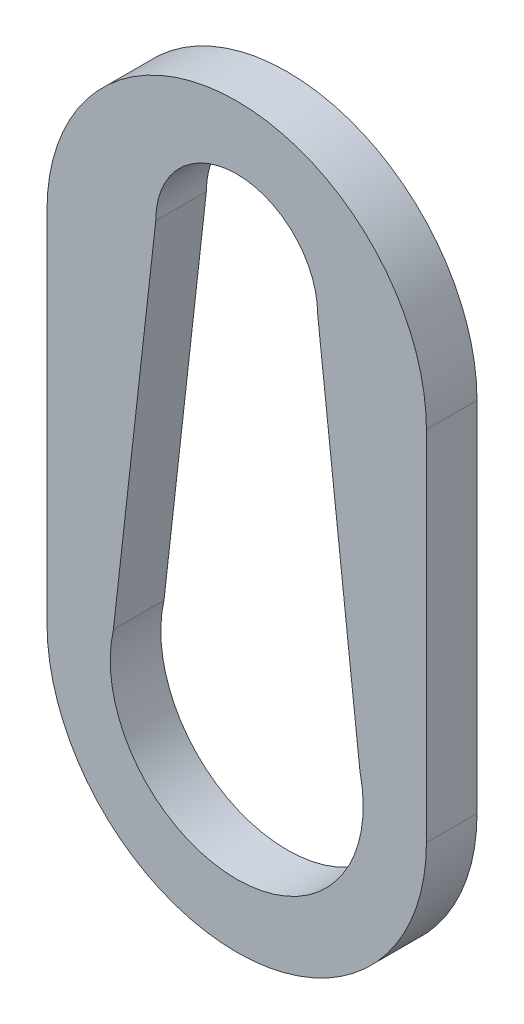
ISO-10303-21;
HEADER;
FILE_DESCRIPTION(('STEP AP214'),'2;1');
FILE_NAME('part.step','',(''),(''),'','','');
FILE_SCHEMA(('AUTOMOTIVE_DESIGN { 1 0 10303 214 1 1 1 1 }'));
ENDSEC;
DATA;
#1=APPLICATION_CONTEXT('core data for automotive mechanical design processes');
#2=APPLICATION_PROTOCOL_DEFINITION('international standard','automotive_design',2000,#1);
#3=PRODUCT_CONTEXT('',#1,'mechanical');
#4=PRODUCT('Part','Part','',(#3));
#5=PRODUCT_RELATED_PRODUCT_CATEGORY('part','',(#4));
#6=PRODUCT_DEFINITION_FORMATION('','',#4);
#7=PRODUCT_DEFINITION_CONTEXT('part definition',#1,'design');
#8=PRODUCT_DEFINITION('design','',#6,#7);
#9=PRODUCT_DEFINITION_SHAPE('','',#8);
#10=(LENGTH_UNIT() NAMED_UNIT(*) SI_UNIT(.MILLI.,.METRE.));
#11=(NAMED_UNIT(*) PLANE_ANGLE_UNIT() SI_UNIT($,.RADIAN.));
#12=(NAMED_UNIT(*) SI_UNIT($,.STERADIAN.) SOLID_ANGLE_UNIT());
#13=UNCERTAINTY_MEASURE_WITH_UNIT(LENGTH_MEASURE(1.E-05),#10,'distance_accuracy_value','');
#14=(GEOMETRIC_REPRESENTATION_CONTEXT(3) GLOBAL_UNCERTAINTY_ASSIGNED_CONTEXT((#13)) GLOBAL_UNIT_ASSIGNED_CONTEXT((#10,
#11,#12)) REPRESENTATION_CONTEXT('',''));
#15=CARTESIAN_POINT('',(0.,0.,0.));
#16=DIRECTION('',(0.,0.,1.));
#17=DIRECTION('',(1.,0.,0.));
#18=AXIS2_PLACEMENT_3D('',#15,#16,#17);
#19=CARTESIAN_POINT('',(73.0854475540437,0.,2.));
#20=DIRECTION('',(-1.,0.,0.));
#21=DIRECTION('',(0.,0.,1.));
#22=AXIS2_PLACEMENT_3D('',#19,#20,#21);
#23=PLANE('',#22);
#24=DIRECTION('',(0.,1.,0.));
#25=VECTOR('',#24,1.);
#26=CARTESIAN_POINT('',(73.0854475540437,0.,0.));
#27=LINE('',#26,#25);
#28=CARTESIAN_POINT('',(73.0854475540437,59.9314759153053,0.));
#29=VERTEX_POINT('',#28);
#30=CARTESIAN_POINT('',(73.0854475540437,74.0776474853053,0.));
#31=VERTEX_POINT('',#30);
#32=EDGE_CURVE('E174',#29,#31,#27,.T.);
#33=ORIENTED_EDGE('',*,*,#32,.F.);
#34=DIRECTION('',(0.,0.,-1.));
#35=VECTOR('',#34,1.);
#36=CARTESIAN_POINT('',(73.0854475540437,59.9314759153053,2.));
#37=LINE('',#36,#35);
#38=CARTESIAN_POINT('',(73.0854475540437,59.9314759153053,2.));
#39=VERTEX_POINT('',#38);
#40=EDGE_CURVE('E11',#39,#29,#37,.T.);
#41=ORIENTED_EDGE('',*,*,#40,.F.);
#42=DIRECTION('',(0.,1.,0.));
#43=VECTOR('',#42,1.);
#44=CARTESIAN_POINT('',(73.0854475540437,0.,2.));
#45=LINE('',#44,#43);
#46=CARTESIAN_POINT('',(73.0854475540437,74.0776474853053,2.));
#47=VERTEX_POINT('',#46);
#48=EDGE_CURVE('E134',#39,#47,#45,.T.);
#49=ORIENTED_EDGE('',*,*,#48,.T.);
#50=DIRECTION('',(0.,0.,-1.));
#51=VECTOR('',#50,1.);
#52=CARTESIAN_POINT('',(73.0854475540437,74.0776474853053,2.));
#53=LINE('',#52,#51);
#54=EDGE_CURVE('E67',#47,#31,#53,.T.);
#55=ORIENTED_EDGE('',*,*,#54,.T.);
#56=EDGE_LOOP('',(#33,#41,#49,#55));
#57=FACE_BOUND('',#56,.T.);
#58=ADVANCED_FACE('F47',(#57),#23,.T.);
#59=CARTESIAN_POINT('',(80.5854475540437,59.9314759153053,2.));
#60=DIRECTION('',(0.,0.,-1.));
#61=DIRECTION('',(-1.,0.,0.));
#62=AXIS2_PLACEMENT_3D('',#59,#60,#61);
#63=CYLINDRICAL_SURFACE('',#62,7.5);
#64=CARTESIAN_POINT('',(80.5854475540437,59.9314759153053,0.));
#65=DIRECTION('',(0.,0.,1.));
#66=DIRECTION('',(1.,0.,0.));
#67=AXIS2_PLACEMENT_3D('',#64,#65,#66);
#68=CIRCLE('',#67,7.5);
#69=CARTESIAN_POINT('',(88.0854475540437,59.9314759153053,0.));
#70=VERTEX_POINT('',#69);
#71=EDGE_CURVE('E140',#29,#70,#68,.T.);
#72=ORIENTED_EDGE('',*,*,#71,.T.);
#73=DIRECTION('',(0.,0.,-1.));
#74=VECTOR('',#73,1.);
#75=CARTESIAN_POINT('',(88.0854475540437,59.9314759153053,2.));
#76=LINE('',#75,#74);
#77=CARTESIAN_POINT('',(88.0854475540437,59.9314759153053,2.));
#78=VERTEX_POINT('',#77);
#79=EDGE_CURVE('E58',#78,#70,#76,.T.);
#80=ORIENTED_EDGE('',*,*,#79,.F.);
#81=CARTESIAN_POINT('',(80.5854475540437,59.9314759153053,2.));
#82=DIRECTION('',(0.,0.,1.));
#83=DIRECTION('',(1.,0.,0.));
#84=AXIS2_PLACEMENT_3D('',#81,#82,#83);
#85=CIRCLE('',#84,7.5);
#86=EDGE_CURVE('E129',#39,#78,#85,.T.);
#87=ORIENTED_EDGE('',*,*,#86,.F.);
#88=ORIENTED_EDGE('',*,*,#40,.T.);
#89=EDGE_LOOP('',(#72,#80,#87,#88));
#90=FACE_BOUND('',#89,.T.);
#91=ADVANCED_FACE('F138',(#90),#63,.T.);
#92=CARTESIAN_POINT('',(88.0854475540437,0.,2.));
#93=DIRECTION('',(-1.,0.,0.));
#94=DIRECTION('',(0.,0.,1.));
#95=AXIS2_PLACEMENT_3D('',#92,#93,#94);
#96=PLANE('',#95);
#97=DIRECTION('',(0.,1.,0.));
#98=VECTOR('',#97,1.);
#99=CARTESIAN_POINT('',(88.0854475540437,0.,0.));
#100=LINE('',#99,#98);
#101=CARTESIAN_POINT('',(88.0854475540437,74.0776474853053,0.));
#102=VERTEX_POINT('',#101);
#103=EDGE_CURVE('E169',#70,#102,#100,.T.);
#104=ORIENTED_EDGE('',*,*,#103,.T.);
#105=DIRECTION('',(0.,0.,-1.));
#106=VECTOR('',#105,1.);
#107=CARTESIAN_POINT('',(88.0854475540437,74.0776474853053,2.));
#108=LINE('',#107,#106);
#109=CARTESIAN_POINT('',(88.0854475540437,74.0776474853053,2.));
#110=VERTEX_POINT('',#109);
#111=EDGE_CURVE('E93',#110,#102,#108,.T.);
#112=ORIENTED_EDGE('',*,*,#111,.F.);
#113=DIRECTION('',(0.,1.,0.));
#114=VECTOR('',#113,1.);
#115=CARTESIAN_POINT('',(88.0854475540437,0.,2.));
#116=LINE('',#115,#114);
#117=EDGE_CURVE('E120',#78,#110,#116,.T.);
#118=ORIENTED_EDGE('',*,*,#117,.F.);
#119=ORIENTED_EDGE('',*,*,#79,.T.);
#120=EDGE_LOOP('',(#104,#112,#118,#119));
#121=FACE_BOUND('',#120,.T.);
#122=ADVANCED_FACE('F122',(#121),#96,.F.);
#123=CARTESIAN_POINT('',(80.5854475540437,75.8776474853053,2.));
#124=DIRECTION('',(0.,0.,-1.));
#125=DIRECTION('',(-1.,0.,0.));
#126=AXIS2_PLACEMENT_3D('',#123,#124,#125);
#127=CYLINDRICAL_SURFACE('',#126,3.19999999999999);
#128=CARTESIAN_POINT('',(80.5854475540437,75.8776474853053,0.));
#129=DIRECTION('',(0.,0.,1.));
#130=DIRECTION('',(1.,0.,0.));
#131=AXIS2_PLACEMENT_3D('',#128,#129,#130);
#132=CIRCLE('',#131,3.19999999999999);
#133=CARTESIAN_POINT('',(83.7854475540437,75.8776474853053,0.));
#134=VERTEX_POINT('',#133);
#135=CARTESIAN_POINT('',(77.3854475540437,75.8776474853053,0.));
#136=VERTEX_POINT('',#135);
#137=EDGE_CURVE('E188',#134,#136,#132,.T.);
#138=ORIENTED_EDGE('',*,*,#137,.F.);
#139=DIRECTION('',(0.,0.,-1.));
#140=VECTOR('',#139,1.);
#141=CARTESIAN_POINT('',(83.7854475540437,75.8776474853053,2.));
#142=LINE('',#141,#140);
#143=CARTESIAN_POINT('',(83.7854475540437,75.8776474853053,2.));
#144=VERTEX_POINT('',#143);
#145=EDGE_CURVE('E51',#144,#134,#142,.T.);
#146=ORIENTED_EDGE('',*,*,#145,.F.);
#147=CARTESIAN_POINT('',(80.5854475540437,75.8776474853053,2.));
#148=DIRECTION('',(0.,0.,1.));
#149=DIRECTION('',(1.,0.,0.));
#150=AXIS2_PLACEMENT_3D('',#147,#148,#149);
#151=CIRCLE('',#150,3.19999999999999);
#152=CARTESIAN_POINT('',(77.3854475540437,75.8776474853053,2.));
#153=VERTEX_POINT('',#152);
#154=EDGE_CURVE('E168',#144,#153,#151,.T.);
#155=ORIENTED_EDGE('',*,*,#154,.T.);
#156=DIRECTION('',(0.,0.,-1.));
#157=VECTOR('',#156,1.);
#158=CARTESIAN_POINT('',(77.3854475540437,75.8776474853053,2.));
#159=LINE('',#158,#157);
#160=EDGE_CURVE('E147',#153,#136,#159,.T.);
#161=ORIENTED_EDGE('',*,*,#160,.T.);
#162=EDGE_LOOP('',(#138,#146,#155,#161));
#163=FACE_BOUND('',#162,.T.);
#164=ADVANCED_FACE('F49',(#163),#127,.F.);
#165=CARTESIAN_POINT('',(91.1885877088426,10.293345782427,2.));
#166=DIRECTION('',(0.993689323621478,0.112167411134826,0.));
#167=DIRECTION('',(-0.112167411134826,0.993689323621478,0.));
#168=AXIS2_PLACEMENT_3D('',#165,#166,#167);
#169=PLANE('',#168);
#170=DIRECTION('',(0.112167411134826,-0.993689323621478,0.));
#171=VECTOR('',#170,1.);
#172=CARTESIAN_POINT('',(91.1885877088426,10.293345782427,0.));
#173=LINE('',#172,#171);
#174=CARTESIAN_POINT('',(85.4596322728368,61.0460715043344,0.));
#175=VERTEX_POINT('',#174);
#176=EDGE_CURVE('E185',#134,#175,#173,.T.);
#177=ORIENTED_EDGE('',*,*,#176,.T.);
#178=DIRECTION('',(0.,0.,-1.));
#179=VECTOR('',#178,1.);
#180=CARTESIAN_POINT('',(85.4596322728368,61.0460715043344,2.));
#181=LINE('',#180,#179);
#182=CARTESIAN_POINT('',(85.4596322728368,61.0460715043344,2.));
#183=VERTEX_POINT('',#182);
#184=EDGE_CURVE('E152',#183,#175,#181,.T.);
#185=ORIENTED_EDGE('',*,*,#184,.F.);
#186=DIRECTION('',(0.112167411134826,-0.993689323621478,0.));
#187=VECTOR('',#186,1.);
#188=CARTESIAN_POINT('',(91.1885877088426,10.293345782427,2.));
#189=LINE('',#188,#187);
#190=EDGE_CURVE('E203',#144,#183,#189,.T.);
#191=ORIENTED_EDGE('',*,*,#190,.F.);
#192=ORIENTED_EDGE('',*,*,#145,.T.);
#193=EDGE_LOOP('',(#177,#185,#191,#192));
#194=FACE_BOUND('',#193,.T.);
#195=ADVANCED_FACE('F217',(#194),#169,.F.);
#196=CARTESIAN_POINT('',(80.5854475540437,59.9314759153053,2.));
#197=DIRECTION('',(0.,0.,-1.));
#198=DIRECTION('',(-1.,0.,0.));
#199=AXIS2_PLACEMENT_3D('',#196,#197,#198);
#200=CYLINDRICAL_SURFACE('',#199,5.00000000000001);
#201=CARTESIAN_POINT('',(80.5854475540437,59.9314759153053,0.));
#202=DIRECTION('',(0.,0.,1.));
#203=DIRECTION('',(1.,0.,0.));
#204=AXIS2_PLACEMENT_3D('',#201,#202,#203);
#205=CIRCLE('',#204,5.00000000000001);
#206=CARTESIAN_POINT('',(75.7112628352505,61.0460715043347,0.));
#207=VERTEX_POINT('',#206);
#208=EDGE_CURVE('E181',#207,#175,#205,.T.);
#209=ORIENTED_EDGE('',*,*,#208,.F.);
#210=DIRECTION('',(0.,0.,-1.));
#211=VECTOR('',#210,1.);
#212=CARTESIAN_POINT('',(75.7112628352505,61.0460715043347,2.));
#213=LINE('',#212,#211);
#214=CARTESIAN_POINT('',(75.7112628352505,61.0460715043347,2.));
#215=VERTEX_POINT('',#214);
#216=EDGE_CURVE('E150',#215,#207,#213,.T.);
#217=ORIENTED_EDGE('',*,*,#216,.F.);
#218=CARTESIAN_POINT('',(80.5854475540437,59.9314759153053,2.));
#219=DIRECTION('',(0.,0.,1.));
#220=DIRECTION('',(1.,0.,0.));
#221=AXIS2_PLACEMENT_3D('',#218,#219,#220);
#222=CIRCLE('',#221,5.00000000000001);
#223=EDGE_CURVE('E200',#215,#183,#222,.T.);
#224=ORIENTED_EDGE('',*,*,#223,.T.);
#225=ORIENTED_EDGE('',*,*,#184,.T.);
#226=EDGE_LOOP('',(#209,#217,#224,#225));
#227=FACE_BOUND('',#226,.T.);
#228=ADVANCED_FACE('F218',(#227),#200,.F.);
#229=CARTESIAN_POINT('',(67.9545312502055,-7.67069109431209,2.));
#230=DIRECTION('',(0.993689323621478,-0.112167411134827,0.));
#231=DIRECTION('',(0.112167411134827,0.993689323621478,0.));
#232=AXIS2_PLACEMENT_3D('',#229,#230,#231);
#233=PLANE('',#232);
#234=DIRECTION('',(-0.112167411134827,-0.993689323621478,0.));
#235=VECTOR('',#234,1.);
#236=CARTESIAN_POINT('',(67.9545312502055,-7.67069109431209,0.));
#237=LINE('',#236,#235);
#238=EDGE_CURVE('E177',#136,#207,#237,.T.);
#239=ORIENTED_EDGE('',*,*,#238,.F.);
#240=ORIENTED_EDGE('',*,*,#160,.F.);
#241=DIRECTION('',(-0.112167411134827,-0.993689323621478,0.));
#242=VECTOR('',#241,1.);
#243=CARTESIAN_POINT('',(67.9545312502055,-7.67069109431209,2.));
#244=LINE('',#243,#242);
#245=EDGE_CURVE('E196',#153,#215,#244,.T.);
#246=ORIENTED_EDGE('',*,*,#245,.T.);
#247=ORIENTED_EDGE('',*,*,#216,.T.);
#248=EDGE_LOOP('',(#239,#240,#246,#247));
#249=FACE_BOUND('',#248,.T.);
#250=ADVANCED_FACE('F213',(#249),#233,.T.);
#251=CARTESIAN_POINT('',(80.5854475540437,74.0776474853053,2.));
#252=DIRECTION('',(0.,0.,-1.));
#253=DIRECTION('',(-1.,0.,0.));
#254=AXIS2_PLACEMENT_3D('',#251,#252,#253);
#255=CYLINDRICAL_SURFACE('',#254,7.5);
#256=CARTESIAN_POINT('',(80.5854475540437,74.0776474853053,0.));
#257=DIRECTION('',(0.,0.,1.));
#258=DIRECTION('',(1.,0.,0.));
#259=AXIS2_PLACEMENT_3D('',#256,#257,#258);
#260=CIRCLE('',#259,7.5);
#261=EDGE_CURVE('E164',#31,#102,#260,.F.);
#262=ORIENTED_EDGE('',*,*,#261,.F.);
#263=ORIENTED_EDGE('',*,*,#54,.F.);
#264=CARTESIAN_POINT('',(80.5854475540437,74.0776474853053,2.));
#265=DIRECTION('',(0.,0.,1.));
#266=DIRECTION('',(1.,0.,0.));
#267=AXIS2_PLACEMENT_3D('',#264,#265,#266);
#268=CIRCLE('',#267,7.5);
#269=EDGE_CURVE('E128',#47,#110,#268,.F.);
#270=ORIENTED_EDGE('',*,*,#269,.T.);
#271=ORIENTED_EDGE('',*,*,#111,.T.);
#272=EDGE_LOOP('',(#262,#263,#270,#271));
#273=FACE_BOUND('',#272,.T.);
#274=ADVANCED_FACE('F225',(#273),#255,.T.);
#275=CARTESIAN_POINT('',(0.,0.,2.));
#276=DIRECTION('',(0.,0.,1.));
#277=DIRECTION('',(1.,0.,0.));
#278=AXIS2_PLACEMENT_3D('',#275,#276,#277);
#279=PLANE('',#278);
#280=ORIENTED_EDGE('',*,*,#154,.F.);
#281=ORIENTED_EDGE('',*,*,#190,.T.);
#282=ORIENTED_EDGE('',*,*,#223,.F.);
#283=ORIENTED_EDGE('',*,*,#245,.F.);
#284=EDGE_LOOP('',(#280,#281,#282,#283));
#285=FACE_BOUND('',#284,.T.);
#286=ORIENTED_EDGE('',*,*,#48,.F.);
#287=ORIENTED_EDGE('',*,*,#86,.T.);
#288=ORIENTED_EDGE('',*,*,#117,.T.);
#289=ORIENTED_EDGE('',*,*,#269,.F.);
#290=EDGE_LOOP('',(#286,#287,#288,#289));
#291=FACE_BOUND('',#290,.T.);
#292=ADVANCED_FACE('F133',(#285,#291),#279,.T.);
#293=CARTESIAN_POINT('',(0.,0.,0.));
#294=DIRECTION('',(0.,0.,1.));
#295=DIRECTION('',(1.,0.,0.));
#296=AXIS2_PLACEMENT_3D('',#293,#294,#295);
#297=PLANE('',#296);
#298=ORIENTED_EDGE('',*,*,#137,.T.);
#299=ORIENTED_EDGE('',*,*,#238,.T.);
#300=ORIENTED_EDGE('',*,*,#208,.T.);
#301=ORIENTED_EDGE('',*,*,#176,.F.);
#302=EDGE_LOOP('',(#298,#299,#300,#301));
#303=FACE_BOUND('',#302,.T.);
#304=ORIENTED_EDGE('',*,*,#32,.T.);
#305=ORIENTED_EDGE('',*,*,#261,.T.);
#306=ORIENTED_EDGE('',*,*,#103,.F.);
#307=ORIENTED_EDGE('',*,*,#71,.F.);
#308=EDGE_LOOP('',(#304,#305,#306,#307));
#309=FACE_BOUND('',#308,.T.);
#310=ADVANCED_FACE('F215',(#303,#309),#297,.F.);
#311=CLOSED_SHELL('',(#58,#91,#122,#164,#195,#228,#250,#274,#292,#310));
#312=MANIFOLD_SOLID_BREP('B2',#311);
#313=ADVANCED_BREP_SHAPE_REPRESENTATION('',(#18,#312),#14);
#314=SHAPE_DEFINITION_REPRESENTATION(#9,#313);
ENDSEC;
END-ISO-10303-21;
